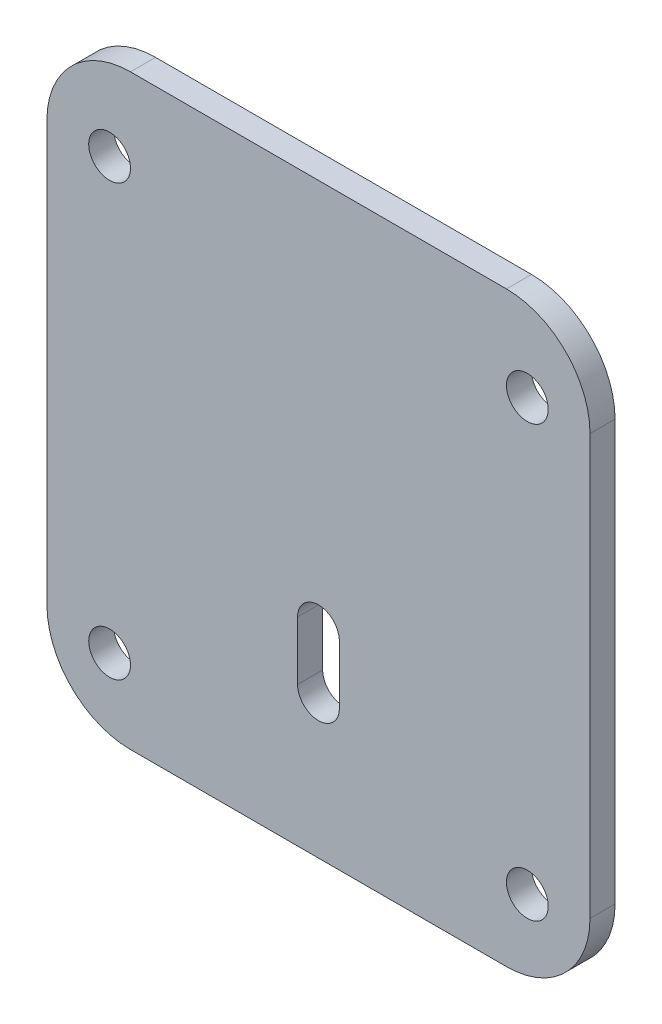
ISO-10303-21;
HEADER;
FILE_DESCRIPTION(('STEP AP214'),'2;1');
FILE_NAME('part.step','',(''),(''),'','','');
FILE_SCHEMA(('AUTOMOTIVE_DESIGN { 1 0 10303 214 1 1 1 1 }'));
ENDSEC;
DATA;
#1=APPLICATION_CONTEXT('core data for automotive mechanical design processes');
#2=APPLICATION_PROTOCOL_DEFINITION('international standard','automotive_design',2000,#1);
#3=PRODUCT_CONTEXT('',#1,'mechanical');
#4=PRODUCT('Part','Part','',(#3));
#5=PRODUCT_RELATED_PRODUCT_CATEGORY('part','',(#4));
#6=PRODUCT_DEFINITION_FORMATION('','',#4);
#7=PRODUCT_DEFINITION_CONTEXT('part definition',#1,'design');
#8=PRODUCT_DEFINITION('design','',#6,#7);
#9=PRODUCT_DEFINITION_SHAPE('','',#8);
#10=(LENGTH_UNIT() NAMED_UNIT(*) SI_UNIT(.MILLI.,.METRE.));
#11=(NAMED_UNIT(*) PLANE_ANGLE_UNIT() SI_UNIT($,.RADIAN.));
#12=(NAMED_UNIT(*) SI_UNIT($,.STERADIAN.) SOLID_ANGLE_UNIT());
#13=UNCERTAINTY_MEASURE_WITH_UNIT(LENGTH_MEASURE(1.E-05),#10,'distance_accuracy_value','');
#14=(GEOMETRIC_REPRESENTATION_CONTEXT(3) GLOBAL_UNCERTAINTY_ASSIGNED_CONTEXT((#13)) GLOBAL_UNIT_ASSIGNED_CONTEXT((#10,
#11,#12)) REPRESENTATION_CONTEXT('',''));
#15=CARTESIAN_POINT('',(0.,0.,0.));
#16=DIRECTION('',(0.,0.,1.));
#17=DIRECTION('',(1.,0.,0.));
#18=AXIS2_PLACEMENT_3D('',#15,#16,#17);
#19=CARTESIAN_POINT('',(0.,0.,3.));
#20=DIRECTION('',(0.,0.,1.));
#21=DIRECTION('',(1.,0.,0.));
#22=AXIS2_PLACEMENT_3D('',#19,#20,#21);
#23=PLANE('',#22);
#24=CARTESIAN_POINT('',(25.,-31.5,3.));
#25=DIRECTION('',(0.,0.,1.));
#26=DIRECTION('',(1.,0.,0.));
#27=AXIS2_PLACEMENT_3D('',#24,#25,#26);
#28=CIRCLE('',#27,2.5);
#29=CARTESIAN_POINT('',(27.5,-31.5,3.));
#30=VERTEX_POINT('',#29);
#31=EDGE_CURVE('E269',#30,#30,#28,.T.);
#32=ORIENTED_EDGE('',*,*,#31,.F.);
#33=EDGE_LOOP('',(#32));
#34=FACE_BOUND('',#33,.T.);
#35=CARTESIAN_POINT('',(-24.9999999999998,-31.5000000000002,3.));
#36=DIRECTION('',(0.,0.,1.));
#37=DIRECTION('',(-1.,0.,0.));
#38=AXIS2_PLACEMENT_3D('',#35,#36,#37);
#39=CIRCLE('',#38,2.5);
#40=CARTESIAN_POINT('',(-27.4999999999998,-31.5000000000002,3.));
#41=VERTEX_POINT('',#40);
#42=EDGE_CURVE('E272',#41,#41,#39,.T.);
#43=ORIENTED_EDGE('',*,*,#42,.F.);
#44=EDGE_LOOP('',(#43));
#45=FACE_BOUND('',#44,.T.);
#46=DIRECTION('',(-1.,0.,0.));
#47=VECTOR('',#46,1.);
#48=CARTESIAN_POINT('',(-32.5,-40.25,3.));
#49=LINE('',#48,#47);
#50=CARTESIAN_POINT('',(22.5,-40.25,3.));
#51=VERTEX_POINT('',#50);
#52=CARTESIAN_POINT('',(-22.5,-40.25,3.));
#53=VERTEX_POINT('',#52);
#54=EDGE_CURVE('E242',#51,#53,#49,.T.);
#55=ORIENTED_EDGE('',*,*,#54,.F.);
#56=CARTESIAN_POINT('',(22.5,-30.25,3.));
#57=DIRECTION('',(0.,0.,1.));
#58=DIRECTION('',(1.,0.,0.));
#59=AXIS2_PLACEMENT_3D('',#56,#57,#58);
#60=CIRCLE('',#59,10.);
#61=CARTESIAN_POINT('',(32.5,-30.25,3.));
#62=VERTEX_POINT('',#61);
#63=EDGE_CURVE('E228',#51,#62,#60,.T.);
#64=ORIENTED_EDGE('',*,*,#63,.T.);
#65=DIRECTION('',(0.,1.,0.));
#66=VECTOR('',#65,1.);
#67=CARTESIAN_POINT('',(32.5,30.,3.));
#68=LINE('',#67,#66);
#69=CARTESIAN_POINT('',(32.5,20.,3.));
#70=VERTEX_POINT('',#69);
#71=EDGE_CURVE('E187',#62,#70,#68,.T.);
#72=ORIENTED_EDGE('',*,*,#71,.T.);
#73=CARTESIAN_POINT('',(22.5,20.,3.));
#74=DIRECTION('',(0.,0.,1.));
#75=DIRECTION('',(1.,0.,0.));
#76=AXIS2_PLACEMENT_3D('',#73,#74,#75);
#77=CIRCLE('',#76,10.);
#78=CARTESIAN_POINT('',(22.5,30.,3.));
#79=VERTEX_POINT('',#78);
#80=EDGE_CURVE('E206',#70,#79,#77,.T.);
#81=ORIENTED_EDGE('',*,*,#80,.T.);
#82=DIRECTION('',(-1.,0.,0.));
#83=VECTOR('',#82,1.);
#84=CARTESIAN_POINT('',(-32.5,30.,3.));
#85=LINE('',#84,#83);
#86=CARTESIAN_POINT('',(-22.5,30.,3.));
#87=VERTEX_POINT('',#86);
#88=EDGE_CURVE('E189',#79,#87,#85,.T.);
#89=ORIENTED_EDGE('',*,*,#88,.T.);
#90=CARTESIAN_POINT('',(-22.5,20.,3.));
#91=DIRECTION('',(0.,0.,1.));
#92=DIRECTION('',(1.,0.,0.));
#93=AXIS2_PLACEMENT_3D('',#90,#91,#92);
#94=CIRCLE('',#93,10.);
#95=CARTESIAN_POINT('',(-32.5,20.,3.));
#96=VERTEX_POINT('',#95);
#97=EDGE_CURVE('E208',#87,#96,#94,.T.);
#98=ORIENTED_EDGE('',*,*,#97,.T.);
#99=DIRECTION('',(0.,-1.,0.));
#100=VECTOR('',#99,1.);
#101=CARTESIAN_POINT('',(-32.5,-62.6407545543055,3.));
#102=LINE('',#101,#100);
#103=CARTESIAN_POINT('',(-32.5,-30.25,3.));
#104=VERTEX_POINT('',#103);
#105=EDGE_CURVE('E193',#96,#104,#102,.T.);
#106=ORIENTED_EDGE('',*,*,#105,.T.);
#107=CARTESIAN_POINT('',(-22.5,-30.25,3.));
#108=DIRECTION('',(0.,0.,1.));
#109=DIRECTION('',(1.,0.,0.));
#110=AXIS2_PLACEMENT_3D('',#107,#108,#109);
#111=CIRCLE('',#110,10.);
#112=EDGE_CURVE('E226',#104,#53,#111,.T.);
#113=ORIENTED_EDGE('',*,*,#112,.T.);
#114=EDGE_LOOP('',(#55,#64,#72,#81,#89,#98,#106,#113));
#115=FACE_BOUND('',#114,.T.);
#116=CARTESIAN_POINT('',(25.,20.,3.));
#117=DIRECTION('',(0.,0.,1.));
#118=DIRECTION('',(1.,0.,0.));
#119=AXIS2_PLACEMENT_3D('',#116,#117,#118);
#120=CIRCLE('',#119,2.5);
#121=CARTESIAN_POINT('',(27.5,20.,3.));
#122=VERTEX_POINT('',#121);
#123=EDGE_CURVE('E181',#122,#122,#120,.T.);
#124=ORIENTED_EDGE('',*,*,#123,.F.);
#125=EDGE_LOOP('',(#124));
#126=FACE_BOUND('',#125,.T.);
#127=CARTESIAN_POINT('',(-25.,20.,3.));
#128=DIRECTION('',(0.,0.,1.));
#129=DIRECTION('',(1.,0.,0.));
#130=AXIS2_PLACEMENT_3D('',#127,#128,#129);
#131=CIRCLE('',#130,2.5);
#132=CARTESIAN_POINT('',(-22.5,20.,3.));
#133=VERTEX_POINT('',#132);
#134=EDGE_CURVE('E175',#133,#133,#131,.T.);
#135=ORIENTED_EDGE('',*,*,#134,.F.);
#136=EDGE_LOOP('',(#135));
#137=FACE_BOUND('',#136,.T.);
#138=DIRECTION('',(0.,-1.,0.));
#139=VECTOR('',#138,1.);
#140=CARTESIAN_POINT('',(-2.50000000000698,-16.5,3.));
#141=LINE('',#140,#139);
#142=CARTESIAN_POINT('',(-2.50000000000698,-16.5,3.));
#143=VERTEX_POINT('',#142);
#144=CARTESIAN_POINT('',(-2.50000000000698,-23.5,3.));
#145=VERTEX_POINT('',#144);
#146=EDGE_CURVE('E142',#143,#145,#141,.T.);
#147=ORIENTED_EDGE('',*,*,#146,.F.);
#148=CARTESIAN_POINT('',(-6.97987588455585E-12,-16.5000000000001,3.));
#149=DIRECTION('',(0.,0.,1.));
#150=DIRECTION('',(1.,0.,0.));
#151=AXIS2_PLACEMENT_3D('',#148,#149,#150);
#152=CIRCLE('',#151,2.5);
#153=CARTESIAN_POINT('',(2.49999999999302,-16.5,3.));
#154=VERTEX_POINT('',#153);
#155=EDGE_CURVE('E132',#154,#143,#152,.T.);
#156=ORIENTED_EDGE('',*,*,#155,.F.);
#157=DIRECTION('',(0.,1.,0.));
#158=VECTOR('',#157,1.);
#159=CARTESIAN_POINT('',(2.49999999999302,-16.5,3.));
#160=LINE('',#159,#158);
#161=CARTESIAN_POINT('',(2.49999999999302,-23.5,3.));
#162=VERTEX_POINT('',#161);
#163=EDGE_CURVE('E157',#162,#154,#160,.T.);
#164=ORIENTED_EDGE('',*,*,#163,.F.);
#165=CARTESIAN_POINT('',(-6.98116176369495E-12,-23.5,3.));
#166=DIRECTION('',(0.,0.,1.));
#167=DIRECTION('',(1.,0.,0.));
#168=AXIS2_PLACEMENT_3D('',#165,#166,#167);
#169=CIRCLE('',#168,2.5);
#170=EDGE_CURVE('E155',#145,#162,#169,.T.);
#171=ORIENTED_EDGE('',*,*,#170,.F.);
#172=EDGE_LOOP('',(#147,#156,#164,#171));
#173=FACE_BOUND('',#172,.T.);
#174=ADVANCED_FACE('F39',(#34,#45,#115,#126,#137,#173),#23,.T.);
#175=CARTESIAN_POINT('',(0.,0.,0.));
#176=DIRECTION('',(0.,0.,1.));
#177=DIRECTION('',(1.,0.,0.));
#178=AXIS2_PLACEMENT_3D('',#175,#176,#177);
#179=PLANE('',#178);
#180=CARTESIAN_POINT('',(25.,-31.5,0.));
#181=DIRECTION('',(0.,0.,1.));
#182=DIRECTION('',(1.,0.,0.));
#183=AXIS2_PLACEMENT_3D('',#180,#181,#182);
#184=CIRCLE('',#183,2.5);
#185=CARTESIAN_POINT('',(27.5,-31.5,0.));
#186=VERTEX_POINT('',#185);
#187=EDGE_CURVE('E267',#186,#186,#184,.T.);
#188=ORIENTED_EDGE('',*,*,#187,.T.);
#189=EDGE_LOOP('',(#188));
#190=FACE_BOUND('',#189,.T.);
#191=CARTESIAN_POINT('',(-24.9999999999998,-31.5000000000002,0.));
#192=DIRECTION('',(0.,0.,1.));
#193=DIRECTION('',(-1.,0.,0.));
#194=AXIS2_PLACEMENT_3D('',#191,#192,#193);
#195=CIRCLE('',#194,2.5);
#196=CARTESIAN_POINT('',(-27.4999999999998,-31.5000000000002,0.));
#197=VERTEX_POINT('',#196);
#198=EDGE_CURVE('E275',#197,#197,#195,.T.);
#199=ORIENTED_EDGE('',*,*,#198,.T.);
#200=EDGE_LOOP('',(#199));
#201=FACE_BOUND('',#200,.T.);
#202=DIRECTION('',(0.,1.,0.));
#203=VECTOR('',#202,1.);
#204=CARTESIAN_POINT('',(32.5,30.,0.));
#205=LINE('',#204,#203);
#206=CARTESIAN_POINT('',(32.5,-30.25,0.));
#207=VERTEX_POINT('',#206);
#208=CARTESIAN_POINT('',(32.5,20.,0.));
#209=VERTEX_POINT('',#208);
#210=EDGE_CURVE('E184',#207,#209,#205,.T.);
#211=ORIENTED_EDGE('',*,*,#210,.F.);
#212=CARTESIAN_POINT('',(22.5,-30.25,0.));
#213=DIRECTION('',(0.,0.,1.));
#214=DIRECTION('',(1.,0.,0.));
#215=AXIS2_PLACEMENT_3D('',#212,#213,#214);
#216=CIRCLE('',#215,10.);
#217=CARTESIAN_POINT('',(22.5,-40.25,0.));
#218=VERTEX_POINT('',#217);
#219=EDGE_CURVE('E47',#207,#218,#216,.F.);
#220=ORIENTED_EDGE('',*,*,#219,.T.);
#221=DIRECTION('',(-1.,0.,0.));
#222=VECTOR('',#221,1.);
#223=CARTESIAN_POINT('',(-32.5,-40.25,0.));
#224=LINE('',#223,#222);
#225=CARTESIAN_POINT('',(-22.5,-40.25,0.));
#226=VERTEX_POINT('',#225);
#227=EDGE_CURVE('E164',#218,#226,#224,.T.);
#228=ORIENTED_EDGE('',*,*,#227,.T.);
#229=CARTESIAN_POINT('',(-22.5,-30.25,0.));
#230=DIRECTION('',(0.,0.,1.));
#231=DIRECTION('',(1.,0.,0.));
#232=AXIS2_PLACEMENT_3D('',#229,#230,#231);
#233=CIRCLE('',#232,10.);
#234=CARTESIAN_POINT('',(-32.5,-30.25,0.));
#235=VERTEX_POINT('',#234);
#236=EDGE_CURVE('E54',#226,#235,#233,.F.);
#237=ORIENTED_EDGE('',*,*,#236,.T.);
#238=DIRECTION('',(0.,-1.,0.));
#239=VECTOR('',#238,1.);
#240=CARTESIAN_POINT('',(-32.5,-62.6407545543055,0.));
#241=LINE('',#240,#239);
#242=CARTESIAN_POINT('',(-32.5,20.,0.));
#243=VERTEX_POINT('',#242);
#244=EDGE_CURVE('E190',#243,#235,#241,.T.);
#245=ORIENTED_EDGE('',*,*,#244,.F.);
#246=CARTESIAN_POINT('',(-22.5,20.,0.));
#247=DIRECTION('',(0.,0.,1.));
#248=DIRECTION('',(1.,0.,0.));
#249=AXIS2_PLACEMENT_3D('',#246,#247,#248);
#250=CIRCLE('',#249,10.);
#251=CARTESIAN_POINT('',(-22.5,30.,0.));
#252=VERTEX_POINT('',#251);
#253=EDGE_CURVE('E204',#243,#252,#250,.F.);
#254=ORIENTED_EDGE('',*,*,#253,.T.);
#255=DIRECTION('',(-1.,0.,0.));
#256=VECTOR('',#255,1.);
#257=CARTESIAN_POINT('',(-32.5,30.,0.));
#258=LINE('',#257,#256);
#259=CARTESIAN_POINT('',(22.5,30.,0.));
#260=VERTEX_POINT('',#259);
#261=EDGE_CURVE('E198',#260,#252,#258,.T.);
#262=ORIENTED_EDGE('',*,*,#261,.F.);
#263=CARTESIAN_POINT('',(22.5,20.,0.));
#264=DIRECTION('',(0.,0.,1.));
#265=DIRECTION('',(1.,0.,0.));
#266=AXIS2_PLACEMENT_3D('',#263,#264,#265);
#267=CIRCLE('',#266,10.);
#268=EDGE_CURVE('E196',#260,#209,#267,.F.);
#269=ORIENTED_EDGE('',*,*,#268,.T.);
#270=EDGE_LOOP('',(#211,#220,#228,#237,#245,#254,#262,#269));
#271=FACE_BOUND('',#270,.T.);
#272=CARTESIAN_POINT('',(-25.,20.,0.));
#273=DIRECTION('',(0.,0.,1.));
#274=DIRECTION('',(1.,0.,0.));
#275=AXIS2_PLACEMENT_3D('',#272,#273,#274);
#276=CIRCLE('',#275,2.5);
#277=CARTESIAN_POINT('',(-22.5,20.,0.));
#278=VERTEX_POINT('',#277);
#279=EDGE_CURVE('E150',#278,#278,#276,.T.);
#280=ORIENTED_EDGE('',*,*,#279,.T.);
#281=EDGE_LOOP('',(#280));
#282=FACE_BOUND('',#281,.T.);
#283=CARTESIAN_POINT('',(25.,20.,0.));
#284=DIRECTION('',(0.,0.,1.));
#285=DIRECTION('',(1.,0.,0.));
#286=AXIS2_PLACEMENT_3D('',#283,#284,#285);
#287=CIRCLE('',#286,2.5);
#288=CARTESIAN_POINT('',(27.5,20.,0.));
#289=VERTEX_POINT('',#288);
#290=EDGE_CURVE('E178',#289,#289,#287,.T.);
#291=ORIENTED_EDGE('',*,*,#290,.T.);
#292=EDGE_LOOP('',(#291));
#293=FACE_BOUND('',#292,.T.);
#294=CARTESIAN_POINT('',(-6.97987588455585E-12,-16.5000000000001,0.));
#295=DIRECTION('',(0.,0.,1.));
#296=DIRECTION('',(1.,0.,0.));
#297=AXIS2_PLACEMENT_3D('',#294,#295,#296);
#298=CIRCLE('',#297,2.5);
#299=CARTESIAN_POINT('',(2.49999999999302,-16.5,0.));
#300=VERTEX_POINT('',#299);
#301=CARTESIAN_POINT('',(-2.50000000000698,-16.5,0.));
#302=VERTEX_POINT('',#301);
#303=EDGE_CURVE('E162',#300,#302,#298,.T.);
#304=ORIENTED_EDGE('',*,*,#303,.T.);
#305=DIRECTION('',(0.,-1.,0.));
#306=VECTOR('',#305,1.);
#307=CARTESIAN_POINT('',(-2.50000000000698,-16.5,0.));
#308=LINE('',#307,#306);
#309=CARTESIAN_POINT('',(-2.50000000000698,-23.5,0.));
#310=VERTEX_POINT('',#309);
#311=EDGE_CURVE('E149',#302,#310,#308,.T.);
#312=ORIENTED_EDGE('',*,*,#311,.T.);
#313=CARTESIAN_POINT('',(-6.98116176369495E-12,-23.5,0.));
#314=DIRECTION('',(0.,0.,1.));
#315=DIRECTION('',(1.,0.,0.));
#316=AXIS2_PLACEMENT_3D('',#313,#314,#315);
#317=CIRCLE('',#316,2.5);
#318=CARTESIAN_POINT('',(2.49999999999302,-23.5,0.));
#319=VERTEX_POINT('',#318);
#320=EDGE_CURVE('E166',#310,#319,#317,.T.);
#321=ORIENTED_EDGE('',*,*,#320,.T.);
#322=DIRECTION('',(0.,1.,0.));
#323=VECTOR('',#322,1.);
#324=CARTESIAN_POINT('',(2.49999999999302,-16.5,0.));
#325=LINE('',#324,#323);
#326=EDGE_CURVE('E143',#319,#300,#325,.T.);
#327=ORIENTED_EDGE('',*,*,#326,.T.);
#328=EDGE_LOOP('',(#304,#312,#321,#327));
#329=FACE_BOUND('',#328,.T.);
#330=ADVANCED_FACE('F233',(#190,#201,#271,#282,#293,#329),#179,.F.);
#331=CARTESIAN_POINT('',(32.5,30.,3.));
#332=DIRECTION('',(-1.,0.,0.));
#333=DIRECTION('',(0.,0.,1.));
#334=AXIS2_PLACEMENT_3D('',#331,#332,#333);
#335=PLANE('',#334);
#336=ORIENTED_EDGE('',*,*,#71,.F.);
#337=DIRECTION('',(0.,0.,1.));
#338=VECTOR('',#337,1.);
#339=CARTESIAN_POINT('',(32.5,-30.25,3.));
#340=LINE('',#339,#338);
#341=EDGE_CURVE('E62',#62,#207,#340,.F.);
#342=ORIENTED_EDGE('',*,*,#341,.T.);
#343=ORIENTED_EDGE('',*,*,#210,.T.);
#344=DIRECTION('',(0.,0.,-1.));
#345=VECTOR('',#344,1.);
#346=CARTESIAN_POINT('',(32.5,20.,3.));
#347=LINE('',#346,#345);
#348=EDGE_CURVE('E210',#209,#70,#347,.F.);
#349=ORIENTED_EDGE('',*,*,#348,.T.);
#350=EDGE_LOOP('',(#336,#342,#343,#349));
#351=FACE_BOUND('',#350,.T.);
#352=ADVANCED_FACE('F247',(#351),#335,.F.);
#353=CARTESIAN_POINT('',(-32.5,30.,3.));
#354=DIRECTION('',(0.,-1.,0.));
#355=DIRECTION('',(0.,0.,-1.));
#356=AXIS2_PLACEMENT_3D('',#353,#354,#355);
#357=PLANE('',#356);
#358=ORIENTED_EDGE('',*,*,#261,.T.);
#359=DIRECTION('',(0.,0.,-1.));
#360=VECTOR('',#359,1.);
#361=CARTESIAN_POINT('',(-22.5,30.,3.));
#362=LINE('',#361,#360);
#363=EDGE_CURVE('E219',#252,#87,#362,.F.);
#364=ORIENTED_EDGE('',*,*,#363,.T.);
#365=ORIENTED_EDGE('',*,*,#88,.F.);
#366=DIRECTION('',(0.,0.,-1.));
#367=VECTOR('',#366,1.);
#368=CARTESIAN_POINT('',(22.5,30.,3.));
#369=LINE('',#368,#367);
#370=EDGE_CURVE('E216',#79,#260,#369,.T.);
#371=ORIENTED_EDGE('',*,*,#370,.T.);
#372=EDGE_LOOP('',(#358,#364,#365,#371));
#373=FACE_BOUND('',#372,.T.);
#374=ADVANCED_FACE('F256',(#373),#357,.F.);
#375=CARTESIAN_POINT('',(-32.5,-62.6407545543055,3.));
#376=DIRECTION('',(1.,0.,0.));
#377=DIRECTION('',(0.,0.,-1.));
#378=AXIS2_PLACEMENT_3D('',#375,#376,#377);
#379=PLANE('',#378);
#380=ORIENTED_EDGE('',*,*,#244,.T.);
#381=DIRECTION('',(0.,0.,1.));
#382=VECTOR('',#381,1.);
#383=CARTESIAN_POINT('',(-32.5,-30.25,3.));
#384=LINE('',#383,#382);
#385=EDGE_CURVE('E12',#235,#104,#384,.T.);
#386=ORIENTED_EDGE('',*,*,#385,.T.);
#387=ORIENTED_EDGE('',*,*,#105,.F.);
#388=DIRECTION('',(0.,0.,-1.));
#389=VECTOR('',#388,1.);
#390=CARTESIAN_POINT('',(-32.5,20.,3.));
#391=LINE('',#390,#389);
#392=EDGE_CURVE('E213',#96,#243,#391,.T.);
#393=ORIENTED_EDGE('',*,*,#392,.T.);
#394=EDGE_LOOP('',(#380,#386,#387,#393));
#395=FACE_BOUND('',#394,.T.);
#396=ADVANCED_FACE('F264',(#395),#379,.F.);
#397=CARTESIAN_POINT('',(25.,20.,3.));
#398=DIRECTION('',(0.,0.,-1.));
#399=DIRECTION('',(-1.,0.,0.));
#400=AXIS2_PLACEMENT_3D('',#397,#398,#399);
#401=CYLINDRICAL_SURFACE('',#400,2.5);
#402=ORIENTED_EDGE('',*,*,#123,.T.);
#403=EDGE_LOOP('',(#402));
#404=FACE_BOUND('',#403,.T.);
#405=ORIENTED_EDGE('',*,*,#290,.F.);
#406=EDGE_LOOP('',(#405));
#407=FACE_BOUND('',#406,.T.);
#408=ADVANCED_FACE('F317',(#404,#407),#401,.F.);
#409=CARTESIAN_POINT('',(-25.,20.,3.));
#410=DIRECTION('',(0.,0.,-1.));
#411=DIRECTION('',(-1.,0.,0.));
#412=AXIS2_PLACEMENT_3D('',#409,#410,#411);
#413=CYLINDRICAL_SURFACE('',#412,2.5);
#414=ORIENTED_EDGE('',*,*,#134,.T.);
#415=EDGE_LOOP('',(#414));
#416=FACE_BOUND('',#415,.T.);
#417=ORIENTED_EDGE('',*,*,#279,.F.);
#418=EDGE_LOOP('',(#417));
#419=FACE_BOUND('',#418,.T.);
#420=ADVANCED_FACE('F314',(#416,#419),#413,.F.);
#421=CARTESIAN_POINT('',(-6.97987588455585E-12,-16.5000000000001,3.));
#422=DIRECTION('',(0.,0.,-1.));
#423=DIRECTION('',(-1.,0.,0.));
#424=AXIS2_PLACEMENT_3D('',#421,#422,#423);
#425=CYLINDRICAL_SURFACE('',#424,2.5);
#426=ORIENTED_EDGE('',*,*,#303,.F.);
#427=DIRECTION('',(0.,0.,-1.));
#428=VECTOR('',#427,1.);
#429=CARTESIAN_POINT('',(2.49999999999302,-16.5,3.));
#430=LINE('',#429,#428);
#431=EDGE_CURVE('E138',#154,#300,#430,.T.);
#432=ORIENTED_EDGE('',*,*,#431,.F.);
#433=ORIENTED_EDGE('',*,*,#155,.T.);
#434=DIRECTION('',(0.,0.,-1.));
#435=VECTOR('',#434,1.);
#436=CARTESIAN_POINT('',(-2.50000000000698,-16.5,3.));
#437=LINE('',#436,#435);
#438=EDGE_CURVE('E135',#143,#302,#437,.T.);
#439=ORIENTED_EDGE('',*,*,#438,.T.);
#440=EDGE_LOOP('',(#426,#432,#433,#439));
#441=FACE_BOUND('',#440,.T.);
#442=ADVANCED_FACE('F134',(#441),#425,.F.);
#443=CARTESIAN_POINT('',(-2.50000000000698,-16.5,3.));
#444=DIRECTION('',(1.,0.,0.));
#445=DIRECTION('',(0.,1.,0.));
#446=AXIS2_PLACEMENT_3D('',#443,#444,#445);
#447=PLANE('',#446);
#448=ORIENTED_EDGE('',*,*,#311,.F.);
#449=ORIENTED_EDGE('',*,*,#438,.F.);
#450=ORIENTED_EDGE('',*,*,#146,.T.);
#451=DIRECTION('',(0.,0.,-1.));
#452=VECTOR('',#451,1.);
#453=CARTESIAN_POINT('',(-2.50000000000698,-23.5,3.));
#454=LINE('',#453,#452);
#455=EDGE_CURVE('E151',#145,#310,#454,.T.);
#456=ORIENTED_EDGE('',*,*,#455,.T.);
#457=EDGE_LOOP('',(#448,#449,#450,#456));
#458=FACE_BOUND('',#457,.T.);
#459=ADVANCED_FACE('F146',(#458),#447,.T.);
#460=CARTESIAN_POINT('',(-6.98116176369495E-12,-23.5,3.));
#461=DIRECTION('',(0.,0.,-1.));
#462=DIRECTION('',(-1.,0.,0.));
#463=AXIS2_PLACEMENT_3D('',#460,#461,#462);
#464=CYLINDRICAL_SURFACE('',#463,2.5);
#465=ORIENTED_EDGE('',*,*,#320,.F.);
#466=ORIENTED_EDGE('',*,*,#455,.F.);
#467=ORIENTED_EDGE('',*,*,#170,.T.);
#468=DIRECTION('',(0.,0.,-1.));
#469=VECTOR('',#468,1.);
#470=CARTESIAN_POINT('',(2.49999999999302,-23.5,3.));
#471=LINE('',#470,#469);
#472=EDGE_CURVE('E172',#162,#319,#471,.T.);
#473=ORIENTED_EDGE('',*,*,#472,.T.);
#474=EDGE_LOOP('',(#465,#466,#467,#473));
#475=FACE_BOUND('',#474,.T.);
#476=ADVANCED_FACE('F305',(#475),#464,.F.);
#477=CARTESIAN_POINT('',(2.49999999999302,-16.5,3.));
#478=DIRECTION('',(-1.,0.,0.));
#479=DIRECTION('',(0.,-1.,0.));
#480=AXIS2_PLACEMENT_3D('',#477,#478,#479);
#481=PLANE('',#480);
#482=ORIENTED_EDGE('',*,*,#326,.F.);
#483=ORIENTED_EDGE('',*,*,#472,.F.);
#484=ORIENTED_EDGE('',*,*,#163,.T.);
#485=ORIENTED_EDGE('',*,*,#431,.T.);
#486=EDGE_LOOP('',(#482,#483,#484,#485));
#487=FACE_BOUND('',#486,.T.);
#488=ADVANCED_FACE('F302',(#487),#481,.T.);
#489=CARTESIAN_POINT('',(-22.5,20.,3.));
#490=DIRECTION('',(0.,0.,-1.));
#491=DIRECTION('',(-1.,0.,0.));
#492=AXIS2_PLACEMENT_3D('',#489,#490,#491);
#493=CYLINDRICAL_SURFACE('',#492,10.);
#494=ORIENTED_EDGE('',*,*,#97,.F.);
#495=ORIENTED_EDGE('',*,*,#363,.F.);
#496=ORIENTED_EDGE('',*,*,#253,.F.);
#497=ORIENTED_EDGE('',*,*,#392,.F.);
#498=EDGE_LOOP('',(#494,#495,#496,#497));
#499=FACE_BOUND('',#498,.T.);
#500=ADVANCED_FACE('F260',(#499),#493,.T.);
#501=CARTESIAN_POINT('',(22.5,20.,3.));
#502=DIRECTION('',(0.,0.,-1.));
#503=DIRECTION('',(-1.,0.,0.));
#504=AXIS2_PLACEMENT_3D('',#501,#502,#503);
#505=CYLINDRICAL_SURFACE('',#504,10.);
#506=ORIENTED_EDGE('',*,*,#80,.F.);
#507=ORIENTED_EDGE('',*,*,#348,.F.);
#508=ORIENTED_EDGE('',*,*,#268,.F.);
#509=ORIENTED_EDGE('',*,*,#370,.F.);
#510=EDGE_LOOP('',(#506,#507,#508,#509));
#511=FACE_BOUND('',#510,.T.);
#512=ADVANCED_FACE('F252',(#511),#505,.T.);
#513=CARTESIAN_POINT('',(-32.5,-40.25,0.));
#514=DIRECTION('',(0.,1.,0.));
#515=DIRECTION('',(0.,0.,1.));
#516=AXIS2_PLACEMENT_3D('',#513,#514,#515);
#517=PLANE('',#516);
#518=ORIENTED_EDGE('',*,*,#227,.F.);
#519=DIRECTION('',(0.,0.,1.));
#520=VECTOR('',#519,1.);
#521=CARTESIAN_POINT('',(22.5,-40.25,0.));
#522=LINE('',#521,#520);
#523=EDGE_CURVE('E223',#218,#51,#522,.T.);
#524=ORIENTED_EDGE('',*,*,#523,.T.);
#525=ORIENTED_EDGE('',*,*,#54,.T.);
#526=DIRECTION('',(0.,0.,1.));
#527=VECTOR('',#526,1.);
#528=CARTESIAN_POINT('',(-22.5,-40.25,0.));
#529=LINE('',#528,#527);
#530=EDGE_CURVE('E221',#53,#226,#529,.F.);
#531=ORIENTED_EDGE('',*,*,#530,.T.);
#532=EDGE_LOOP('',(#518,#524,#525,#531));
#533=FACE_BOUND('',#532,.T.);
#534=ADVANCED_FACE('F238',(#533),#517,.F.);
#535=CARTESIAN_POINT('',(22.5,-30.25,0.));
#536=DIRECTION('',(0.,0.,1.));
#537=DIRECTION('',(1.,0.,0.));
#538=AXIS2_PLACEMENT_3D('',#535,#536,#537);
#539=CYLINDRICAL_SURFACE('',#538,10.);
#540=ORIENTED_EDGE('',*,*,#219,.F.);
#541=ORIENTED_EDGE('',*,*,#341,.F.);
#542=ORIENTED_EDGE('',*,*,#63,.F.);
#543=ORIENTED_EDGE('',*,*,#523,.F.);
#544=EDGE_LOOP('',(#540,#541,#542,#543));
#545=FACE_BOUND('',#544,.T.);
#546=ADVANCED_FACE('F244',(#545),#539,.T.);
#547=CARTESIAN_POINT('',(-22.5,-30.25,3.));
#548=DIRECTION('',(0.,0.,1.));
#549=DIRECTION('',(1.,0.,0.));
#550=AXIS2_PLACEMENT_3D('',#547,#548,#549);
#551=CYLINDRICAL_SURFACE('',#550,10.);
#552=ORIENTED_EDGE('',*,*,#236,.F.);
#553=ORIENTED_EDGE('',*,*,#530,.F.);
#554=ORIENTED_EDGE('',*,*,#112,.F.);
#555=ORIENTED_EDGE('',*,*,#385,.F.);
#556=EDGE_LOOP('',(#552,#553,#554,#555));
#557=FACE_BOUND('',#556,.T.);
#558=ADVANCED_FACE('F41',(#557),#551,.T.);
#559=CARTESIAN_POINT('',(-24.9999999999998,-31.5000000000002,0.));
#560=DIRECTION('',(0.,0.,1.));
#561=DIRECTION('',(1.,0.,0.));
#562=AXIS2_PLACEMENT_3D('',#559,#560,#561);
#563=CYLINDRICAL_SURFACE('',#562,2.5);
#564=ORIENTED_EDGE('',*,*,#198,.F.);
#565=EDGE_LOOP('',(#564));
#566=FACE_BOUND('',#565,.T.);
#567=ORIENTED_EDGE('',*,*,#42,.T.);
#568=EDGE_LOOP('',(#567));
#569=FACE_BOUND('',#568,.T.);
#570=ADVANCED_FACE('F288',(#566,#569),#563,.F.);
#571=CARTESIAN_POINT('',(25.,-31.5,0.));
#572=DIRECTION('',(0.,0.,1.));
#573=DIRECTION('',(1.,0.,0.));
#574=AXIS2_PLACEMENT_3D('',#571,#572,#573);
#575=CYLINDRICAL_SURFACE('',#574,2.5);
#576=ORIENTED_EDGE('',*,*,#187,.F.);
#577=EDGE_LOOP('',(#576));
#578=FACE_BOUND('',#577,.T.);
#579=ORIENTED_EDGE('',*,*,#31,.T.);
#580=EDGE_LOOP('',(#579));
#581=FACE_BOUND('',#580,.T.);
#582=ADVANCED_FACE('F281',(#578,#581),#575,.F.);
#583=CLOSED_SHELL('',(#174,#330,#352,#374,#396,#408,#420,#442,#459,#476,#488,#500,#512,#534,
#546,#558,#570,#582));
#584=MANIFOLD_SOLID_BREP('B2',#583);
#585=ADVANCED_BREP_SHAPE_REPRESENTATION('',(#18,#584),#14);
#586=SHAPE_DEFINITION_REPRESENTATION(#9,#585);
ENDSEC;
END-ISO-10303-21;
